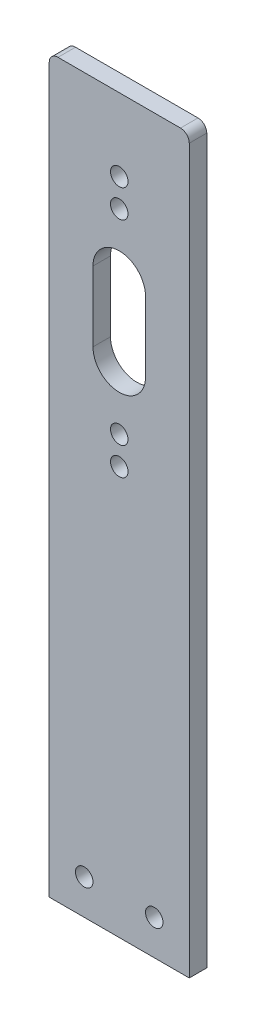
ISO-10303-21;
HEADER;
FILE_DESCRIPTION(('STEP AP214'),'2;1');
FILE_NAME('part.step','',(''),(''),'','','');
FILE_SCHEMA(('AUTOMOTIVE_DESIGN { 1 0 10303 214 1 1 1 1 }'));
ENDSEC;
DATA;
#1=APPLICATION_CONTEXT('core data for automotive mechanical design processes');
#2=APPLICATION_PROTOCOL_DEFINITION('international standard','automotive_design',2000,#1);
#3=PRODUCT_CONTEXT('',#1,'mechanical');
#4=PRODUCT('Part','Part','',(#3));
#5=PRODUCT_RELATED_PRODUCT_CATEGORY('part','',(#4));
#6=PRODUCT_DEFINITION_FORMATION('','',#4);
#7=PRODUCT_DEFINITION_CONTEXT('part definition',#1,'design');
#8=PRODUCT_DEFINITION('design','',#6,#7);
#9=PRODUCT_DEFINITION_SHAPE('','',#8);
#10=(LENGTH_UNIT() NAMED_UNIT(*) SI_UNIT(.MILLI.,.METRE.));
#11=(NAMED_UNIT(*) PLANE_ANGLE_UNIT() SI_UNIT($,.RADIAN.));
#12=(NAMED_UNIT(*) SI_UNIT($,.STERADIAN.) SOLID_ANGLE_UNIT());
#13=UNCERTAINTY_MEASURE_WITH_UNIT(LENGTH_MEASURE(1.E-05),#10,'distance_accuracy_value','');
#14=(GEOMETRIC_REPRESENTATION_CONTEXT(3) GLOBAL_UNCERTAINTY_ASSIGNED_CONTEXT((#13)) GLOBAL_UNIT_ASSIGNED_CONTEXT((#10,
#11,#12)) REPRESENTATION_CONTEXT('',''));
#15=CARTESIAN_POINT('',(0.,0.,0.));
#16=DIRECTION('',(0.,0.,1.));
#17=DIRECTION('',(1.,0.,0.));
#18=AXIS2_PLACEMENT_3D('',#15,#16,#17);
#19=CARTESIAN_POINT('',(-25.4,132.715,3.175));
#20=DIRECTION('',(0.,0.,-1.));
#21=DIRECTION('',(-1.,0.,0.));
#22=AXIS2_PLACEMENT_3D('',#19,#20,#21);
#23=PLANE('',#22);
#24=CARTESIAN_POINT('',(-12.7,-120.015,3.175));
#25=DIRECTION('',(0.,0.,1.));
#26=DIRECTION('',(1.,0.,0.));
#27=AXIS2_PLACEMENT_3D('',#24,#25,#26);
#28=CIRCLE('',#27,3.17499999999998);
#29=CARTESIAN_POINT('',(-9.52500000000001,-120.015,3.175));
#30=VERTEX_POINT('',#29);
#31=EDGE_CURVE('E156',#30,#30,#28,.T.);
#32=ORIENTED_EDGE('',*,*,#31,.F.);
#33=EDGE_LOOP('',(#32));
#34=FACE_BOUND('',#33,.T.);
#35=CARTESIAN_POINT('',(0.,25.4,3.175));
#36=DIRECTION('',(0.,0.,1.));
#37=DIRECTION('',(1.,0.,0.));
#38=AXIS2_PLACEMENT_3D('',#35,#36,#37);
#39=CIRCLE('',#38,3.175);
#40=CARTESIAN_POINT('',(3.175,25.4,3.175));
#41=VERTEX_POINT('',#40);
#42=EDGE_CURVE('E168',#41,#41,#39,.T.);
#43=ORIENTED_EDGE('',*,*,#42,.F.);
#44=EDGE_LOOP('',(#43));
#45=FACE_BOUND('',#44,.T.);
#46=CARTESIAN_POINT('',(0.,96.19742,3.175));
#47=DIRECTION('',(0.,0.,1.));
#48=DIRECTION('',(1.,0.,0.));
#49=AXIS2_PLACEMENT_3D('',#46,#47,#48);
#50=CIRCLE('',#49,3.17499999999999);
#51=CARTESIAN_POINT('',(3.17499999999999,96.19742,3.175));
#52=VERTEX_POINT('',#51);
#53=EDGE_CURVE('E180',#52,#52,#50,.T.);
#54=ORIENTED_EDGE('',*,*,#53,.F.);
#55=EDGE_LOOP('',(#54));
#56=FACE_BOUND('',#55,.T.);
#57=DIRECTION('',(0.,1.,0.));
#58=VECTOR('',#57,1.);
#59=CARTESIAN_POINT('',(25.4,-132.715,3.175));
#60=LINE('',#59,#58);
#61=CARTESIAN_POINT('',(25.4,-132.715,3.175));
#62=VERTEX_POINT('',#61);
#63=CARTESIAN_POINT('',(25.4,129.54,3.175));
#64=VERTEX_POINT('',#63);
#65=EDGE_CURVE('E197',#62,#64,#60,.T.);
#66=ORIENTED_EDGE('',*,*,#65,.T.);
#67=CARTESIAN_POINT('',(22.225,129.54,3.175));
#68=DIRECTION('',(0.,0.,-1.));
#69=DIRECTION('',(-1.,0.,0.));
#70=AXIS2_PLACEMENT_3D('',#67,#68,#69);
#71=CIRCLE('',#70,3.175);
#72=CARTESIAN_POINT('',(22.225,132.715,3.175));
#73=VERTEX_POINT('',#72);
#74=EDGE_CURVE('E42',#64,#73,#71,.F.);
#75=ORIENTED_EDGE('',*,*,#74,.T.);
#76=DIRECTION('',(-1.,0.,0.));
#77=VECTOR('',#76,1.);
#78=CARTESIAN_POINT('',(-25.4,132.715,3.175));
#79=LINE('',#78,#77);
#80=CARTESIAN_POINT('',(-22.225,132.715,3.175));
#81=VERTEX_POINT('',#80);
#82=EDGE_CURVE('E199',#73,#81,#79,.T.);
#83=ORIENTED_EDGE('',*,*,#82,.T.);
#84=CARTESIAN_POINT('',(-22.225,129.54,3.175));
#85=DIRECTION('',(0.,0.,-1.));
#86=DIRECTION('',(-1.,0.,0.));
#87=AXIS2_PLACEMENT_3D('',#84,#85,#86);
#88=CIRCLE('',#87,3.175);
#89=CARTESIAN_POINT('',(-25.4,129.54,3.175));
#90=VERTEX_POINT('',#89);
#91=EDGE_CURVE('E49',#81,#90,#88,.F.);
#92=ORIENTED_EDGE('',*,*,#91,.T.);
#93=DIRECTION('',(0.,-1.,0.));
#94=VECTOR('',#93,1.);
#95=CARTESIAN_POINT('',(-25.4,-132.715,3.175));
#96=LINE('',#95,#94);
#97=CARTESIAN_POINT('',(-25.4,-132.715,3.175));
#98=VERTEX_POINT('',#97);
#99=EDGE_CURVE('E192',#90,#98,#96,.T.);
#100=ORIENTED_EDGE('',*,*,#99,.T.);
#101=DIRECTION('',(1.,0.,0.));
#102=VECTOR('',#101,1.);
#103=CARTESIAN_POINT('',(-25.4,-132.715,3.175));
#104=LINE('',#103,#102);
#105=EDGE_CURVE('E194',#98,#62,#104,.T.);
#106=ORIENTED_EDGE('',*,*,#105,.T.);
#107=EDGE_LOOP('',(#66,#75,#83,#92,#100,#106));
#108=FACE_BOUND('',#107,.T.);
#109=CARTESIAN_POINT('',(0.,106.35742,3.175));
#110=DIRECTION('',(0.,0.,1.));
#111=DIRECTION('',(1.,0.,0.));
#112=AXIS2_PLACEMENT_3D('',#109,#110,#111);
#113=CIRCLE('',#112,3.17499999999999);
#114=CARTESIAN_POINT('',(3.17499999999999,106.35742,3.175));
#115=VERTEX_POINT('',#114);
#116=EDGE_CURVE('E186',#115,#115,#113,.T.);
#117=ORIENTED_EDGE('',*,*,#116,.F.);
#118=EDGE_LOOP('',(#117));
#119=FACE_BOUND('',#118,.T.);
#120=CARTESIAN_POINT('',(0.,15.24,3.175));
#121=DIRECTION('',(0.,0.,1.));
#122=DIRECTION('',(1.,0.,0.));
#123=AXIS2_PLACEMENT_3D('',#120,#121,#122);
#124=CIRCLE('',#123,3.175);
#125=CARTESIAN_POINT('',(3.175,15.24,3.175));
#126=VERTEX_POINT('',#125);
#127=EDGE_CURVE('E174',#126,#126,#124,.T.);
#128=ORIENTED_EDGE('',*,*,#127,.F.);
#129=EDGE_LOOP('',(#128));
#130=FACE_BOUND('',#129,.T.);
#131=CARTESIAN_POINT('',(12.7,-120.015,3.175));
#132=DIRECTION('',(0.,0.,1.));
#133=DIRECTION('',(1.,0.,0.));
#134=AXIS2_PLACEMENT_3D('',#131,#132,#133);
#135=CIRCLE('',#134,3.17499999999998);
#136=CARTESIAN_POINT('',(15.875,-120.015,3.175));
#137=VERTEX_POINT('',#136);
#138=EDGE_CURVE('E162',#137,#137,#135,.T.);
#139=ORIENTED_EDGE('',*,*,#138,.F.);
#140=EDGE_LOOP('',(#139));
#141=FACE_BOUND('',#140,.T.);
#142=CARTESIAN_POINT('',(0.,48.09871,3.175));
#143=DIRECTION('',(0.,0.,1.));
#144=DIRECTION('',(1.,0.,0.));
#145=AXIS2_PLACEMENT_3D('',#142,#143,#144);
#146=CIRCLE('',#145,9.525);
#147=CARTESIAN_POINT('',(-9.525,48.09871,3.175));
#148=VERTEX_POINT('',#147);
#149=CARTESIAN_POINT('',(9.525,48.09871,3.175));
#150=VERTEX_POINT('',#149);
#151=EDGE_CURVE('E115',#148,#150,#146,.T.);
#152=ORIENTED_EDGE('',*,*,#151,.F.);
#153=DIRECTION('',(0.,-1.,0.));
#154=VECTOR('',#153,1.);
#155=CARTESIAN_POINT('',(-9.525,48.09871,3.175));
#156=LINE('',#155,#154);
#157=CARTESIAN_POINT('',(-9.52500000000001,73.49871,3.175));
#158=VERTEX_POINT('',#157);
#159=EDGE_CURVE('E140',#158,#148,#156,.T.);
#160=ORIENTED_EDGE('',*,*,#159,.F.);
#161=CARTESIAN_POINT('',(0.,73.49871,3.175));
#162=DIRECTION('',(0.,0.,1.));
#163=DIRECTION('',(1.,0.,0.));
#164=AXIS2_PLACEMENT_3D('',#161,#162,#163);
#165=CIRCLE('',#164,9.525);
#166=CARTESIAN_POINT('',(9.525,73.49871,3.175));
#167=VERTEX_POINT('',#166);
#168=EDGE_CURVE('E138',#167,#158,#165,.T.);
#169=ORIENTED_EDGE('',*,*,#168,.F.);
#170=DIRECTION('',(0.,1.,0.));
#171=VECTOR('',#170,1.);
#172=CARTESIAN_POINT('',(9.525,73.49871,3.175));
#173=LINE('',#172,#171);
#174=EDGE_CURVE('E125',#150,#167,#173,.T.);
#175=ORIENTED_EDGE('',*,*,#174,.F.);
#176=EDGE_LOOP('',(#152,#160,#169,#175));
#177=FACE_BOUND('',#176,.T.);
#178=ADVANCED_FACE('F34',(#34,#45,#56,#108,#119,#130,#141,#177),#23,.F.);
#179=CARTESIAN_POINT('',(-25.4,132.715,-3.175));
#180=DIRECTION('',(0.,0.,-1.));
#181=DIRECTION('',(-1.,0.,0.));
#182=AXIS2_PLACEMENT_3D('',#179,#180,#181);
#183=PLANE('',#182);
#184=CARTESIAN_POINT('',(-12.7,-120.015,-3.175));
#185=DIRECTION('',(0.,0.,1.));
#186=DIRECTION('',(1.,0.,0.));
#187=AXIS2_PLACEMENT_3D('',#184,#185,#186);
#188=CIRCLE('',#187,3.17499999999998);
#189=CARTESIAN_POINT('',(-9.52500000000001,-120.015,-3.175));
#190=VERTEX_POINT('',#189);
#191=EDGE_CURVE('E133',#190,#190,#188,.T.);
#192=ORIENTED_EDGE('',*,*,#191,.T.);
#193=EDGE_LOOP('',(#192));
#194=FACE_BOUND('',#193,.T.);
#195=CARTESIAN_POINT('',(0.,25.4,-3.175));
#196=DIRECTION('',(0.,0.,1.));
#197=DIRECTION('',(1.,0.,0.));
#198=AXIS2_PLACEMENT_3D('',#195,#196,#197);
#199=CIRCLE('',#198,3.175);
#200=CARTESIAN_POINT('',(3.175,25.4,-3.175));
#201=VERTEX_POINT('',#200);
#202=EDGE_CURVE('E165',#201,#201,#199,.T.);
#203=ORIENTED_EDGE('',*,*,#202,.T.);
#204=EDGE_LOOP('',(#203));
#205=FACE_BOUND('',#204,.T.);
#206=CARTESIAN_POINT('',(0.,96.19742,-3.175));
#207=DIRECTION('',(0.,0.,1.));
#208=DIRECTION('',(1.,0.,0.));
#209=AXIS2_PLACEMENT_3D('',#206,#207,#208);
#210=CIRCLE('',#209,3.17499999999999);
#211=CARTESIAN_POINT('',(3.17499999999999,96.19742,-3.175));
#212=VERTEX_POINT('',#211);
#213=EDGE_CURVE('E177',#212,#212,#210,.T.);
#214=ORIENTED_EDGE('',*,*,#213,.T.);
#215=EDGE_LOOP('',(#214));
#216=FACE_BOUND('',#215,.T.);
#217=DIRECTION('',(-1.,0.,0.));
#218=VECTOR('',#217,1.);
#219=CARTESIAN_POINT('',(-25.4,132.715,-3.175));
#220=LINE('',#219,#218);
#221=CARTESIAN_POINT('',(22.225,132.715,-3.175));
#222=VERTEX_POINT('',#221);
#223=CARTESIAN_POINT('',(-22.225,132.715,-3.175));
#224=VERTEX_POINT('',#223);
#225=EDGE_CURVE('E195',#222,#224,#220,.T.);
#226=ORIENTED_EDGE('',*,*,#225,.F.);
#227=CARTESIAN_POINT('',(22.225,129.54,-3.175));
#228=DIRECTION('',(0.,0.,-1.));
#229=DIRECTION('',(-1.,0.,0.));
#230=AXIS2_PLACEMENT_3D('',#227,#228,#229);
#231=CIRCLE('',#230,3.175);
#232=CARTESIAN_POINT('',(25.4,129.54,-3.175));
#233=VERTEX_POINT('',#232);
#234=EDGE_CURVE('E221',#222,#233,#231,.T.);
#235=ORIENTED_EDGE('',*,*,#234,.T.);
#236=DIRECTION('',(0.,1.,0.));
#237=VECTOR('',#236,1.);
#238=CARTESIAN_POINT('',(25.4,-132.715,-3.175));
#239=LINE('',#238,#237);
#240=CARTESIAN_POINT('',(25.4,-132.715,-3.175));
#241=VERTEX_POINT('',#240);
#242=EDGE_CURVE('E205',#241,#233,#239,.T.);
#243=ORIENTED_EDGE('',*,*,#242,.F.);
#244=DIRECTION('',(1.,0.,0.));
#245=VECTOR('',#244,1.);
#246=CARTESIAN_POINT('',(-25.4,-132.715,-3.175));
#247=LINE('',#246,#245);
#248=CARTESIAN_POINT('',(-25.4,-132.715,-3.175));
#249=VERTEX_POINT('',#248);
#250=EDGE_CURVE('E203',#249,#241,#247,.T.);
#251=ORIENTED_EDGE('',*,*,#250,.F.);
#252=DIRECTION('',(0.,-1.,0.));
#253=VECTOR('',#252,1.);
#254=CARTESIAN_POINT('',(-25.4,-132.715,-3.175));
#255=LINE('',#254,#253);
#256=CARTESIAN_POINT('',(-25.4,129.54,-3.175));
#257=VERTEX_POINT('',#256);
#258=EDGE_CURVE('E189',#257,#249,#255,.T.);
#259=ORIENTED_EDGE('',*,*,#258,.F.);
#260=CARTESIAN_POINT('',(-22.225,129.54,-3.175));
#261=DIRECTION('',(0.,0.,-1.));
#262=DIRECTION('',(-1.,0.,0.));
#263=AXIS2_PLACEMENT_3D('',#260,#261,#262);
#264=CIRCLE('',#263,3.175);
#265=EDGE_CURVE('E219',#257,#224,#264,.T.);
#266=ORIENTED_EDGE('',*,*,#265,.T.);
#267=EDGE_LOOP('',(#226,#235,#243,#251,#259,#266));
#268=FACE_BOUND('',#267,.T.);
#269=CARTESIAN_POINT('',(0.,106.35742,-3.175));
#270=DIRECTION('',(0.,0.,1.));
#271=DIRECTION('',(1.,0.,0.));
#272=AXIS2_PLACEMENT_3D('',#269,#270,#271);
#273=CIRCLE('',#272,3.17499999999999);
#274=CARTESIAN_POINT('',(3.17499999999999,106.35742,-3.175));
#275=VERTEX_POINT('',#274);
#276=EDGE_CURVE('E183',#275,#275,#273,.T.);
#277=ORIENTED_EDGE('',*,*,#276,.T.);
#278=EDGE_LOOP('',(#277));
#279=FACE_BOUND('',#278,.T.);
#280=CARTESIAN_POINT('',(0.,15.24,-3.175));
#281=DIRECTION('',(0.,0.,1.));
#282=DIRECTION('',(1.,0.,0.));
#283=AXIS2_PLACEMENT_3D('',#280,#281,#282);
#284=CIRCLE('',#283,3.175);
#285=CARTESIAN_POINT('',(3.175,15.24,-3.175));
#286=VERTEX_POINT('',#285);
#287=EDGE_CURVE('E171',#286,#286,#284,.T.);
#288=ORIENTED_EDGE('',*,*,#287,.T.);
#289=EDGE_LOOP('',(#288));
#290=FACE_BOUND('',#289,.T.);
#291=CARTESIAN_POINT('',(12.7,-120.015,-3.175));
#292=DIRECTION('',(0.,0.,1.));
#293=DIRECTION('',(1.,0.,0.));
#294=AXIS2_PLACEMENT_3D('',#291,#292,#293);
#295=CIRCLE('',#294,3.17499999999998);
#296=CARTESIAN_POINT('',(15.875,-120.015,-3.175));
#297=VERTEX_POINT('',#296);
#298=EDGE_CURVE('E159',#297,#297,#295,.T.);
#299=ORIENTED_EDGE('',*,*,#298,.T.);
#300=EDGE_LOOP('',(#299));
#301=FACE_BOUND('',#300,.T.);
#302=DIRECTION('',(0.,-1.,0.));
#303=VECTOR('',#302,1.);
#304=CARTESIAN_POINT('',(-9.525,48.09871,-3.175));
#305=LINE('',#304,#303);
#306=CARTESIAN_POINT('',(-9.52500000000001,73.49871,-3.175));
#307=VERTEX_POINT('',#306);
#308=CARTESIAN_POINT('',(-9.525,48.09871,-3.175));
#309=VERTEX_POINT('',#308);
#310=EDGE_CURVE('E126',#307,#309,#305,.T.);
#311=ORIENTED_EDGE('',*,*,#310,.T.);
#312=CARTESIAN_POINT('',(0.,48.09871,-3.175));
#313=DIRECTION('',(0.,0.,1.));
#314=DIRECTION('',(1.,0.,0.));
#315=AXIS2_PLACEMENT_3D('',#312,#313,#314);
#316=CIRCLE('',#315,9.525);
#317=CARTESIAN_POINT('',(9.525,48.09871,-3.175));
#318=VERTEX_POINT('',#317);
#319=EDGE_CURVE('E144',#309,#318,#316,.T.);
#320=ORIENTED_EDGE('',*,*,#319,.T.);
#321=DIRECTION('',(0.,1.,0.));
#322=VECTOR('',#321,1.);
#323=CARTESIAN_POINT('',(9.525,73.49871,-3.175));
#324=LINE('',#323,#322);
#325=CARTESIAN_POINT('',(9.525,73.49871,-3.175));
#326=VERTEX_POINT('',#325);
#327=EDGE_CURVE('E132',#318,#326,#324,.T.);
#328=ORIENTED_EDGE('',*,*,#327,.T.);
#329=CARTESIAN_POINT('',(0.,73.49871,-3.175));
#330=DIRECTION('',(0.,0.,1.));
#331=DIRECTION('',(1.,0.,0.));
#332=AXIS2_PLACEMENT_3D('',#329,#330,#331);
#333=CIRCLE('',#332,9.525);
#334=EDGE_CURVE('E147',#326,#307,#333,.T.);
#335=ORIENTED_EDGE('',*,*,#334,.T.);
#336=EDGE_LOOP('',(#311,#320,#328,#335));
#337=FACE_BOUND('',#336,.T.);
#338=ADVANCED_FACE('F236',(#194,#205,#216,#268,#279,#290,#301,#337),#183,.T.);
#339=CARTESIAN_POINT('',(-25.4,-132.715,3.175));
#340=DIRECTION('',(1.,0.,0.));
#341=DIRECTION('',(0.,0.,-1.));
#342=AXIS2_PLACEMENT_3D('',#339,#340,#341);
#343=PLANE('',#342);
#344=ORIENTED_EDGE('',*,*,#99,.F.);
#345=DIRECTION('',(0.,0.,-1.));
#346=VECTOR('',#345,1.);
#347=CARTESIAN_POINT('',(-25.4,129.54,3.175));
#348=LINE('',#347,#346);
#349=EDGE_CURVE('E11',#90,#257,#348,.T.);
#350=ORIENTED_EDGE('',*,*,#349,.T.);
#351=ORIENTED_EDGE('',*,*,#258,.T.);
#352=DIRECTION('',(0.,0.,-1.));
#353=VECTOR('',#352,1.);
#354=CARTESIAN_POINT('',(-25.4,-132.715,3.175));
#355=LINE('',#354,#353);
#356=EDGE_CURVE('E211',#98,#249,#355,.T.);
#357=ORIENTED_EDGE('',*,*,#356,.F.);
#358=EDGE_LOOP('',(#344,#350,#351,#357));
#359=FACE_BOUND('',#358,.T.);
#360=ADVANCED_FACE('F247',(#359),#343,.F.);
#361=CARTESIAN_POINT('',(-25.4,-132.715,3.175));
#362=DIRECTION('',(0.,1.,0.));
#363=DIRECTION('',(0.,0.,1.));
#364=AXIS2_PLACEMENT_3D('',#361,#362,#363);
#365=PLANE('',#364);
#366=ORIENTED_EDGE('',*,*,#250,.T.);
#367=DIRECTION('',(0.,0.,-1.));
#368=VECTOR('',#367,1.);
#369=CARTESIAN_POINT('',(25.4,-132.715,3.175));
#370=LINE('',#369,#368);
#371=EDGE_CURVE('E201',#62,#241,#370,.T.);
#372=ORIENTED_EDGE('',*,*,#371,.F.);
#373=ORIENTED_EDGE('',*,*,#105,.F.);
#374=ORIENTED_EDGE('',*,*,#356,.T.);
#375=EDGE_LOOP('',(#366,#372,#373,#374));
#376=FACE_BOUND('',#375,.T.);
#377=ADVANCED_FACE('F243',(#376),#365,.F.);
#378=CARTESIAN_POINT('',(25.4,-132.715,3.175));
#379=DIRECTION('',(-1.,0.,0.));
#380=DIRECTION('',(0.,0.,1.));
#381=AXIS2_PLACEMENT_3D('',#378,#379,#380);
#382=PLANE('',#381);
#383=ORIENTED_EDGE('',*,*,#242,.T.);
#384=DIRECTION('',(0.,0.,-1.));
#385=VECTOR('',#384,1.);
#386=CARTESIAN_POINT('',(25.4,129.54,3.175));
#387=LINE('',#386,#385);
#388=EDGE_CURVE('E57',#233,#64,#387,.F.);
#389=ORIENTED_EDGE('',*,*,#388,.T.);
#390=ORIENTED_EDGE('',*,*,#65,.F.);
#391=ORIENTED_EDGE('',*,*,#371,.T.);
#392=EDGE_LOOP('',(#383,#389,#390,#391));
#393=FACE_BOUND('',#392,.T.);
#394=ADVANCED_FACE('F239',(#393),#382,.F.);
#395=CARTESIAN_POINT('',(-25.4,132.715,3.175));
#396=DIRECTION('',(0.,-1.,0.));
#397=DIRECTION('',(0.,0.,-1.));
#398=AXIS2_PLACEMENT_3D('',#395,#396,#397);
#399=PLANE('',#398);
#400=ORIENTED_EDGE('',*,*,#82,.F.);
#401=DIRECTION('',(0.,0.,-1.));
#402=VECTOR('',#401,1.);
#403=CARTESIAN_POINT('',(22.225,132.715,3.175));
#404=LINE('',#403,#402);
#405=EDGE_CURVE('E216',#73,#222,#404,.T.);
#406=ORIENTED_EDGE('',*,*,#405,.T.);
#407=ORIENTED_EDGE('',*,*,#225,.T.);
#408=DIRECTION('',(0.,0.,-1.));
#409=VECTOR('',#408,1.);
#410=CARTESIAN_POINT('',(-22.225,132.715,3.175));
#411=LINE('',#410,#409);
#412=EDGE_CURVE('E214',#224,#81,#411,.F.);
#413=ORIENTED_EDGE('',*,*,#412,.T.);
#414=EDGE_LOOP('',(#400,#406,#407,#413));
#415=FACE_BOUND('',#414,.T.);
#416=ADVANCED_FACE('F230',(#415),#399,.F.);
#417=CARTESIAN_POINT('',(0.,106.35742,3.175));
#418=DIRECTION('',(0.,0.,-1.));
#419=DIRECTION('',(-1.,0.,0.));
#420=AXIS2_PLACEMENT_3D('',#417,#418,#419);
#421=CYLINDRICAL_SURFACE('',#420,3.17499999999999);
#422=ORIENTED_EDGE('',*,*,#116,.T.);
#423=EDGE_LOOP('',(#422));
#424=FACE_BOUND('',#423,.T.);
#425=ORIENTED_EDGE('',*,*,#276,.F.);
#426=EDGE_LOOP('',(#425));
#427=FACE_BOUND('',#426,.T.);
#428=ADVANCED_FACE('F266',(#424,#427),#421,.F.);
#429=CARTESIAN_POINT('',(0.,96.19742,3.175));
#430=DIRECTION('',(0.,0.,-1.));
#431=DIRECTION('',(-1.,0.,0.));
#432=AXIS2_PLACEMENT_3D('',#429,#430,#431);
#433=CYLINDRICAL_SURFACE('',#432,3.17499999999999);
#434=ORIENTED_EDGE('',*,*,#53,.T.);
#435=EDGE_LOOP('',(#434));
#436=FACE_BOUND('',#435,.T.);
#437=ORIENTED_EDGE('',*,*,#213,.F.);
#438=EDGE_LOOP('',(#437));
#439=FACE_BOUND('',#438,.T.);
#440=ADVANCED_FACE('F299',(#436,#439),#433,.F.);
#441=CARTESIAN_POINT('',(0.,15.24,3.175));
#442=DIRECTION('',(0.,0.,-1.));
#443=DIRECTION('',(-1.,0.,0.));
#444=AXIS2_PLACEMENT_3D('',#441,#442,#443);
#445=CYLINDRICAL_SURFACE('',#444,3.175);
#446=ORIENTED_EDGE('',*,*,#127,.T.);
#447=EDGE_LOOP('',(#446));
#448=FACE_BOUND('',#447,.T.);
#449=ORIENTED_EDGE('',*,*,#287,.F.);
#450=EDGE_LOOP('',(#449));
#451=FACE_BOUND('',#450,.T.);
#452=ADVANCED_FACE('F306',(#448,#451),#445,.F.);
#453=CARTESIAN_POINT('',(0.,25.4,3.175));
#454=DIRECTION('',(0.,0.,-1.));
#455=DIRECTION('',(-1.,0.,0.));
#456=AXIS2_PLACEMENT_3D('',#453,#454,#455);
#457=CYLINDRICAL_SURFACE('',#456,3.175);
#458=ORIENTED_EDGE('',*,*,#42,.T.);
#459=EDGE_LOOP('',(#458));
#460=FACE_BOUND('',#459,.T.);
#461=ORIENTED_EDGE('',*,*,#202,.F.);
#462=EDGE_LOOP('',(#461));
#463=FACE_BOUND('',#462,.T.);
#464=ADVANCED_FACE('F313',(#460,#463),#457,.F.);
#465=CARTESIAN_POINT('',(12.7,-120.015,3.175));
#466=DIRECTION('',(0.,0.,-1.));
#467=DIRECTION('',(-1.,0.,0.));
#468=AXIS2_PLACEMENT_3D('',#465,#466,#467);
#469=CYLINDRICAL_SURFACE('',#468,3.17499999999998);
#470=ORIENTED_EDGE('',*,*,#138,.T.);
#471=EDGE_LOOP('',(#470));
#472=FACE_BOUND('',#471,.T.);
#473=ORIENTED_EDGE('',*,*,#298,.F.);
#474=EDGE_LOOP('',(#473));
#475=FACE_BOUND('',#474,.T.);
#476=ADVANCED_FACE('F321',(#472,#475),#469,.F.);
#477=CARTESIAN_POINT('',(-12.7,-120.015,3.175));
#478=DIRECTION('',(0.,0.,-1.));
#479=DIRECTION('',(-1.,0.,0.));
#480=AXIS2_PLACEMENT_3D('',#477,#478,#479);
#481=CYLINDRICAL_SURFACE('',#480,3.17499999999998);
#482=ORIENTED_EDGE('',*,*,#31,.T.);
#483=EDGE_LOOP('',(#482));
#484=FACE_BOUND('',#483,.T.);
#485=ORIENTED_EDGE('',*,*,#191,.F.);
#486=EDGE_LOOP('',(#485));
#487=FACE_BOUND('',#486,.T.);
#488=ADVANCED_FACE('F329',(#484,#487),#481,.F.);
#489=CARTESIAN_POINT('',(0.,48.09871,3.175));
#490=DIRECTION('',(0.,0.,-1.));
#491=DIRECTION('',(-1.,0.,0.));
#492=AXIS2_PLACEMENT_3D('',#489,#490,#491);
#493=CYLINDRICAL_SURFACE('',#492,9.525);
#494=ORIENTED_EDGE('',*,*,#319,.F.);
#495=DIRECTION('',(0.,0.,-1.));
#496=VECTOR('',#495,1.);
#497=CARTESIAN_POINT('',(-9.525,48.09871,3.175));
#498=LINE('',#497,#496);
#499=EDGE_CURVE('E121',#148,#309,#498,.T.);
#500=ORIENTED_EDGE('',*,*,#499,.F.);
#501=ORIENTED_EDGE('',*,*,#151,.T.);
#502=DIRECTION('',(0.,0.,-1.));
#503=VECTOR('',#502,1.);
#504=CARTESIAN_POINT('',(9.525,48.09871,3.175));
#505=LINE('',#504,#503);
#506=EDGE_CURVE('E118',#150,#318,#505,.T.);
#507=ORIENTED_EDGE('',*,*,#506,.T.);
#508=EDGE_LOOP('',(#494,#500,#501,#507));
#509=FACE_BOUND('',#508,.T.);
#510=ADVANCED_FACE('F117',(#509),#493,.F.);
#511=CARTESIAN_POINT('',(9.525,73.49871,3.175));
#512=DIRECTION('',(-1.,0.,0.));
#513=DIRECTION('',(0.,-1.,0.));
#514=AXIS2_PLACEMENT_3D('',#511,#512,#513);
#515=PLANE('',#514);
#516=ORIENTED_EDGE('',*,*,#327,.F.);
#517=ORIENTED_EDGE('',*,*,#506,.F.);
#518=ORIENTED_EDGE('',*,*,#174,.T.);
#519=DIRECTION('',(0.,0.,-1.));
#520=VECTOR('',#519,1.);
#521=CARTESIAN_POINT('',(9.525,73.49871,3.175));
#522=LINE('',#521,#520);
#523=EDGE_CURVE('E134',#167,#326,#522,.T.);
#524=ORIENTED_EDGE('',*,*,#523,.T.);
#525=EDGE_LOOP('',(#516,#517,#518,#524));
#526=FACE_BOUND('',#525,.T.);
#527=ADVANCED_FACE('F129',(#526),#515,.T.);
#528=CARTESIAN_POINT('',(0.,73.49871,3.175));
#529=DIRECTION('',(0.,0.,-1.));
#530=DIRECTION('',(-1.,0.,0.));
#531=AXIS2_PLACEMENT_3D('',#528,#529,#530);
#532=CYLINDRICAL_SURFACE('',#531,9.525);
#533=ORIENTED_EDGE('',*,*,#334,.F.);
#534=ORIENTED_EDGE('',*,*,#523,.F.);
#535=ORIENTED_EDGE('',*,*,#168,.T.);
#536=DIRECTION('',(0.,0.,-1.));
#537=VECTOR('',#536,1.);
#538=CARTESIAN_POINT('',(-9.52500000000001,73.49871,3.175));
#539=LINE('',#538,#537);
#540=EDGE_CURVE('E153',#158,#307,#539,.T.);
#541=ORIENTED_EDGE('',*,*,#540,.T.);
#542=EDGE_LOOP('',(#533,#534,#535,#541));
#543=FACE_BOUND('',#542,.T.);
#544=ADVANCED_FACE('F350',(#543),#532,.F.);
#545=CARTESIAN_POINT('',(-9.525,48.09871,3.175));
#546=DIRECTION('',(1.,0.,0.));
#547=DIRECTION('',(0.,1.,0.));
#548=AXIS2_PLACEMENT_3D('',#545,#546,#547);
#549=PLANE('',#548);
#550=ORIENTED_EDGE('',*,*,#310,.F.);
#551=ORIENTED_EDGE('',*,*,#540,.F.);
#552=ORIENTED_EDGE('',*,*,#159,.T.);
#553=ORIENTED_EDGE('',*,*,#499,.T.);
#554=EDGE_LOOP('',(#550,#551,#552,#553));
#555=FACE_BOUND('',#554,.T.);
#556=ADVANCED_FACE('F254',(#555),#549,.T.);
#557=CARTESIAN_POINT('',(22.225,129.54,3.175));
#558=DIRECTION('',(0.,0.,-1.));
#559=DIRECTION('',(-1.,0.,0.));
#560=AXIS2_PLACEMENT_3D('',#557,#558,#559);
#561=CYLINDRICAL_SURFACE('',#560,3.175);
#562=ORIENTED_EDGE('',*,*,#74,.F.);
#563=ORIENTED_EDGE('',*,*,#388,.F.);
#564=ORIENTED_EDGE('',*,*,#234,.F.);
#565=ORIENTED_EDGE('',*,*,#405,.F.);
#566=EDGE_LOOP('',(#562,#563,#564,#565));
#567=FACE_BOUND('',#566,.T.);
#568=ADVANCED_FACE('F233',(#567),#561,.T.);
#569=CARTESIAN_POINT('',(-22.225,129.54,3.175));
#570=DIRECTION('',(0.,0.,-1.));
#571=DIRECTION('',(-1.,0.,0.));
#572=AXIS2_PLACEMENT_3D('',#569,#570,#571);
#573=CYLINDRICAL_SURFACE('',#572,3.175);
#574=ORIENTED_EDGE('',*,*,#91,.F.);
#575=ORIENTED_EDGE('',*,*,#412,.F.);
#576=ORIENTED_EDGE('',*,*,#265,.F.);
#577=ORIENTED_EDGE('',*,*,#349,.F.);
#578=EDGE_LOOP('',(#574,#575,#576,#577));
#579=FACE_BOUND('',#578,.T.);
#580=ADVANCED_FACE('F36',(#579),#573,.T.);
#581=CLOSED_SHELL('',(#178,#338,#360,#377,#394,#416,#428,#440,#452,#464,#476,#488,#510,#527,
#544,#556,#568,#580));
#582=MANIFOLD_SOLID_BREP('B2',#581);
#583=ADVANCED_BREP_SHAPE_REPRESENTATION('',(#18,#582),#14);
#584=SHAPE_DEFINITION_REPRESENTATION(#9,#583);
ENDSEC;
END-ISO-10303-21;
